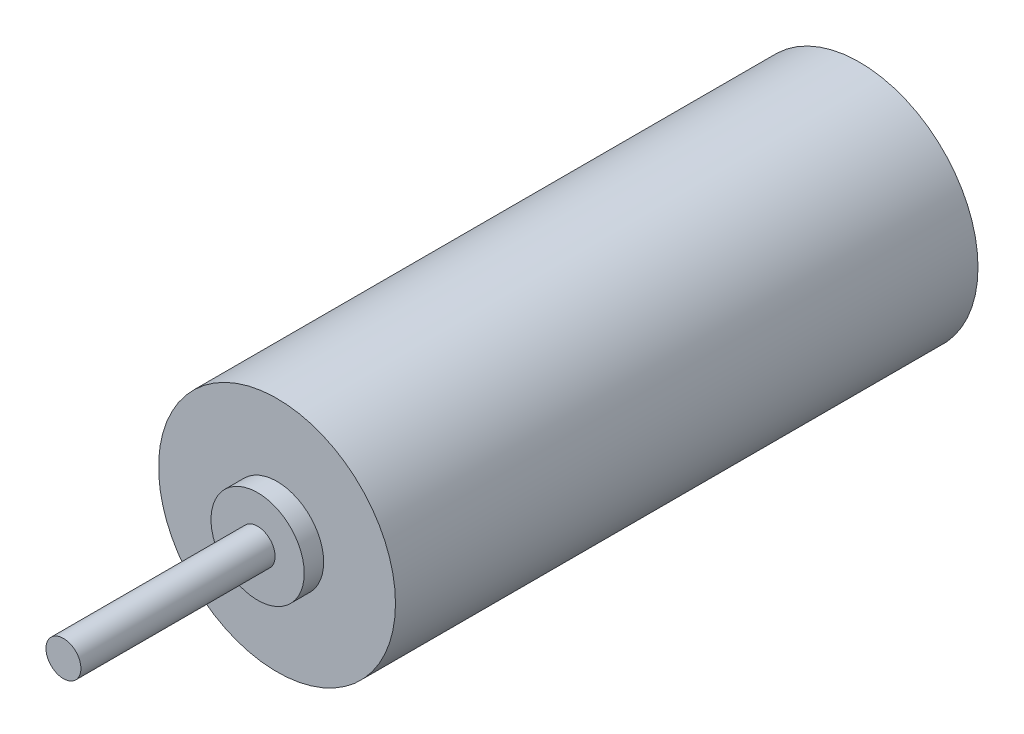
ISO-10303-21;
HEADER;
FILE_DESCRIPTION(('STEP AP214'),'2;1');
FILE_NAME('part.step','',(''),(''),'','','');
FILE_SCHEMA(('AUTOMOTIVE_DESIGN { 1 0 10303 214 1 1 1 1 }'));
ENDSEC;
DATA;
#1=APPLICATION_CONTEXT('core data for automotive mechanical design processes');
#2=APPLICATION_PROTOCOL_DEFINITION('international standard','automotive_design',2000,#1);
#3=PRODUCT_CONTEXT('',#1,'mechanical');
#4=PRODUCT('Part','Part','',(#3));
#5=PRODUCT_RELATED_PRODUCT_CATEGORY('part','',(#4));
#6=PRODUCT_DEFINITION_FORMATION('','',#4);
#7=PRODUCT_DEFINITION_CONTEXT('part definition',#1,'design');
#8=PRODUCT_DEFINITION('design','',#6,#7);
#9=PRODUCT_DEFINITION_SHAPE('','',#8);
#10=(LENGTH_UNIT() NAMED_UNIT(*) SI_UNIT(.MILLI.,.METRE.));
#11=(NAMED_UNIT(*) PLANE_ANGLE_UNIT() SI_UNIT($,.RADIAN.));
#12=(NAMED_UNIT(*) SI_UNIT($,.STERADIAN.) SOLID_ANGLE_UNIT());
#13=UNCERTAINTY_MEASURE_WITH_UNIT(LENGTH_MEASURE(1.E-05),#10,'distance_accuracy_value','');
#14=(GEOMETRIC_REPRESENTATION_CONTEXT(3) GLOBAL_UNCERTAINTY_ASSIGNED_CONTEXT((#13)) GLOBAL_UNIT_ASSIGNED_CONTEXT((#10,
#11,#12)) REPRESENTATION_CONTEXT('',''));
#15=CARTESIAN_POINT('',(0.,0.,0.));
#16=DIRECTION('',(0.,0.,1.));
#17=DIRECTION('',(1.,0.,0.));
#18=AXIS2_PLACEMENT_3D('',#15,#16,#17);
#19=CARTESIAN_POINT('',(0.,0.,15.));
#20=DIRECTION('',(0.,0.,-1.));
#21=DIRECTION('',(-1.,0.,0.));
#22=AXIS2_PLACEMENT_3D('',#19,#20,#21);
#23=CYLINDRICAL_SURFACE('',#22,3.05);
#24=CARTESIAN_POINT('',(0.,0.,15.));
#25=DIRECTION('',(0.,0.,1.));
#26=DIRECTION('',(1.,0.,0.));
#27=AXIS2_PLACEMENT_3D('',#24,#25,#26);
#28=CIRCLE('',#27,3.05);
#29=CARTESIAN_POINT('',(3.05,0.,15.));
#30=VERTEX_POINT('',#29);
#31=EDGE_CURVE('E48',#30,#30,#28,.T.);
#32=ORIENTED_EDGE('',*,*,#31,.F.);
#33=EDGE_LOOP('',(#32));
#34=FACE_BOUND('',#33,.T.);
#35=CARTESIAN_POINT('',(0.,0.,0.));
#36=DIRECTION('',(0.,0.,1.));
#37=DIRECTION('',(1.,0.,0.));
#38=AXIS2_PLACEMENT_3D('',#35,#36,#37);
#39=CIRCLE('',#38,3.05);
#40=CARTESIAN_POINT('',(3.05,0.,0.));
#41=VERTEX_POINT('',#40);
#42=EDGE_CURVE('E39',#41,#41,#39,.T.);
#43=ORIENTED_EDGE('',*,*,#42,.T.);
#44=EDGE_LOOP('',(#43));
#45=FACE_BOUND('',#44,.T.);
#46=ADVANCED_FACE('F36',(#34,#45),#23,.T.);
#47=CARTESIAN_POINT('',(0.,0.,15.));
#48=DIRECTION('',(0.,0.,1.));
#49=DIRECTION('',(1.,0.,0.));
#50=AXIS2_PLACEMENT_3D('',#47,#48,#49);
#51=PLANE('',#50);
#52=CARTESIAN_POINT('',(0.,0.,15.));
#53=DIRECTION('',(0.,0.,1.));
#54=DIRECTION('',(1.,0.,0.));
#55=AXIS2_PLACEMENT_3D('',#52,#53,#54);
#56=CIRCLE('',#55,1.2);
#57=CARTESIAN_POINT('',(1.2,0.,15.));
#58=VERTEX_POINT('',#57);
#59=EDGE_CURVE('E43',#58,#58,#56,.T.);
#60=ORIENTED_EDGE('',*,*,#59,.F.);
#61=EDGE_LOOP('',(#60));
#62=FACE_BOUND('',#61,.T.);
#63=ORIENTED_EDGE('',*,*,#31,.T.);
#64=EDGE_LOOP('',(#63));
#65=FACE_BOUND('',#64,.T.);
#66=ADVANCED_FACE('F65',(#62,#65),#51,.T.);
#67=CARTESIAN_POINT('',(0.,0.,0.));
#68=DIRECTION('',(0.,0.,1.));
#69=DIRECTION('',(1.,0.,0.));
#70=AXIS2_PLACEMENT_3D('',#67,#68,#69);
#71=PLANE('',#70);
#72=ORIENTED_EDGE('',*,*,#42,.F.);
#73=EDGE_LOOP('',(#72));
#74=FACE_BOUND('',#73,.T.);
#75=ADVANCED_FACE('F62',(#74),#71,.F.);
#76=CARTESIAN_POINT('',(0.,0.,15.5));
#77=DIRECTION('',(0.,0.,-1.));
#78=DIRECTION('',(-1.,0.,0.));
#79=AXIS2_PLACEMENT_3D('',#76,#77,#78);
#80=CYLINDRICAL_SURFACE('',#79,1.2);
#81=CARTESIAN_POINT('',(0.,0.,15.5));
#82=DIRECTION('',(0.,0.,1.));
#83=DIRECTION('',(1.,0.,0.));
#84=AXIS2_PLACEMENT_3D('',#81,#82,#83);
#85=CIRCLE('',#84,1.2);
#86=CARTESIAN_POINT('',(1.2,0.,15.5));
#87=VERTEX_POINT('',#86);
#88=EDGE_CURVE('E53',#87,#87,#85,.T.);
#89=ORIENTED_EDGE('',*,*,#88,.F.);
#90=EDGE_LOOP('',(#89));
#91=FACE_BOUND('',#90,.T.);
#92=ORIENTED_EDGE('',*,*,#59,.T.);
#93=EDGE_LOOP('',(#92));
#94=FACE_BOUND('',#93,.T.);
#95=ADVANCED_FACE('F64',(#91,#94),#80,.T.);
#96=CARTESIAN_POINT('',(0.,0.,15.5));
#97=DIRECTION('',(0.,0.,1.));
#98=DIRECTION('',(1.,0.,0.));
#99=AXIS2_PLACEMENT_3D('',#96,#97,#98);
#100=PLANE('',#99);
#101=CARTESIAN_POINT('',(0.,0.,15.5));
#102=DIRECTION('',(0.,0.,1.));
#103=DIRECTION('',(1.,0.,0.));
#104=AXIS2_PLACEMENT_3D('',#101,#102,#103);
#105=CIRCLE('',#104,0.45);
#106=CARTESIAN_POINT('',(0.45,0.,15.5));
#107=VERTEX_POINT('',#106);
#108=EDGE_CURVE('E10',#107,#107,#105,.T.);
#109=ORIENTED_EDGE('',*,*,#108,.F.);
#110=EDGE_LOOP('',(#109));
#111=FACE_BOUND('',#110,.T.);
#112=ORIENTED_EDGE('',*,*,#88,.T.);
#113=EDGE_LOOP('',(#112));
#114=FACE_BOUND('',#113,.T.);
#115=ADVANCED_FACE('F69',(#111,#114),#100,.T.);
#116=CARTESIAN_POINT('',(0.,0.,20.5));
#117=DIRECTION('',(0.,0.,-1.));
#118=DIRECTION('',(-1.,0.,0.));
#119=AXIS2_PLACEMENT_3D('',#116,#117,#118);
#120=CYLINDRICAL_SURFACE('',#119,0.45);
#121=CARTESIAN_POINT('',(0.,0.,20.5));
#122=DIRECTION('',(0.,0.,1.));
#123=DIRECTION('',(1.,0.,0.));
#124=AXIS2_PLACEMENT_3D('',#121,#122,#123);
#125=CIRCLE('',#124,0.45);
#126=CARTESIAN_POINT('',(0.45,0.,20.5));
#127=VERTEX_POINT('',#126);
#128=EDGE_CURVE('E52',#127,#127,#125,.T.);
#129=ORIENTED_EDGE('',*,*,#128,.F.);
#130=EDGE_LOOP('',(#129));
#131=FACE_BOUND('',#130,.T.);
#132=ORIENTED_EDGE('',*,*,#108,.T.);
#133=EDGE_LOOP('',(#132));
#134=FACE_BOUND('',#133,.T.);
#135=ADVANCED_FACE('F98',(#131,#134),#120,.T.);
#136=CARTESIAN_POINT('',(0.,0.,20.5));
#137=DIRECTION('',(0.,0.,1.));
#138=DIRECTION('',(1.,0.,0.));
#139=AXIS2_PLACEMENT_3D('',#136,#137,#138);
#140=PLANE('',#139);
#141=ORIENTED_EDGE('',*,*,#128,.T.);
#142=EDGE_LOOP('',(#141));
#143=FACE_BOUND('',#142,.T.);
#144=ADVANCED_FACE('F107',(#143),#140,.T.);
#145=CLOSED_SHELL('',(#46,#66,#75,#95,#115,#135,#144));
#146=MANIFOLD_SOLID_BREP('B2',#145);
#147=ADVANCED_BREP_SHAPE_REPRESENTATION('',(#18,#146),#14);
#148=SHAPE_DEFINITION_REPRESENTATION(#9,#147);
ENDSEC;
END-ISO-10303-21;
